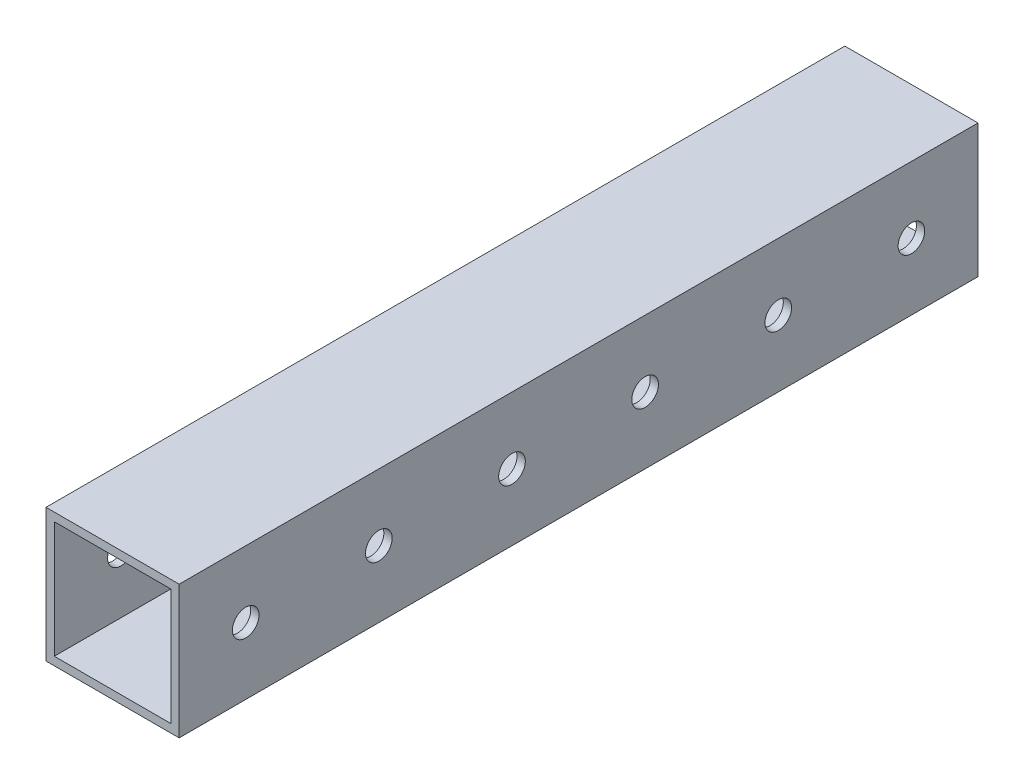
ISO-10303-21;
HEADER;
FILE_DESCRIPTION(('STEP AP214'),'2;1');
FILE_NAME('part.step','',(''),(''),'','','');
FILE_SCHEMA(('AUTOMOTIVE_DESIGN { 1 0 10303 214 1 1 1 1 }'));
ENDSEC;
DATA;
#1=APPLICATION_CONTEXT('core data for automotive mechanical design processes');
#2=APPLICATION_PROTOCOL_DEFINITION('international standard','automotive_design',2000,#1);
#3=PRODUCT_CONTEXT('',#1,'mechanical');
#4=PRODUCT('Part','Part','',(#3));
#5=PRODUCT_RELATED_PRODUCT_CATEGORY('part','',(#4));
#6=PRODUCT_DEFINITION_FORMATION('','',#4);
#7=PRODUCT_DEFINITION_CONTEXT('part definition',#1,'design');
#8=PRODUCT_DEFINITION('design','',#6,#7);
#9=PRODUCT_DEFINITION_SHAPE('','',#8);
#10=(LENGTH_UNIT() NAMED_UNIT(*) SI_UNIT(.MILLI.,.METRE.));
#11=(NAMED_UNIT(*) PLANE_ANGLE_UNIT() SI_UNIT($,.RADIAN.));
#12=(NAMED_UNIT(*) SI_UNIT($,.STERADIAN.) SOLID_ANGLE_UNIT());
#13=UNCERTAINTY_MEASURE_WITH_UNIT(LENGTH_MEASURE(1.E-05),#10,'distance_accuracy_value','');
#14=(GEOMETRIC_REPRESENTATION_CONTEXT(3) GLOBAL_UNCERTAINTY_ASSIGNED_CONTEXT((#13)) GLOBAL_UNIT_ASSIGNED_CONTEXT((#10,
#11,#12)) REPRESENTATION_CONTEXT('',''));
#15=CARTESIAN_POINT('',(0.,0.,0.));
#16=DIRECTION('',(0.,0.,1.));
#17=DIRECTION('',(1.,0.,0.));
#18=AXIS2_PLACEMENT_3D('',#15,#16,#17);
#19=CARTESIAN_POINT('',(0.,0.,152.4));
#20=DIRECTION('',(0.,0.,-1.));
#21=DIRECTION('',(-1.,0.,0.));
#22=AXIS2_PLACEMENT_3D('',#19,#20,#21);
#23=PLANE('',#22);
#24=DIRECTION('',(0.,-1.,0.));
#25=VECTOR('',#24,1.);
#26=CARTESIAN_POINT('',(0.,0.,152.4));
#27=LINE('',#26,#25);
#28=CARTESIAN_POINT('',(0.,25.4,152.4));
#29=VERTEX_POINT('',#28);
#30=CARTESIAN_POINT('',(0.,0.,152.4));
#31=VERTEX_POINT('',#30);
#32=EDGE_CURVE('E157',#29,#31,#27,.T.);
#33=ORIENTED_EDGE('',*,*,#32,.T.);
#34=DIRECTION('',(1.,0.,0.));
#35=VECTOR('',#34,1.);
#36=CARTESIAN_POINT('',(0.,0.,152.4));
#37=LINE('',#36,#35);
#38=CARTESIAN_POINT('',(25.4,0.,152.4));
#39=VERTEX_POINT('',#38);
#40=EDGE_CURVE('E161',#31,#39,#37,.T.);
#41=ORIENTED_EDGE('',*,*,#40,.T.);
#42=DIRECTION('',(0.,1.,0.));
#43=VECTOR('',#42,1.);
#44=CARTESIAN_POINT('',(25.4,0.,152.4));
#45=LINE('',#44,#43);
#46=CARTESIAN_POINT('',(25.4,25.4,152.4));
#47=VERTEX_POINT('',#46);
#48=EDGE_CURVE('E165',#39,#47,#45,.T.);
#49=ORIENTED_EDGE('',*,*,#48,.T.);
#50=DIRECTION('',(-1.,0.,0.));
#51=VECTOR('',#50,1.);
#52=CARTESIAN_POINT('',(0.,25.4,152.4));
#53=LINE('',#52,#51);
#54=EDGE_CURVE('E168',#47,#29,#53,.T.);
#55=ORIENTED_EDGE('',*,*,#54,.T.);
#56=EDGE_LOOP('',(#33,#41,#49,#55));
#57=FACE_BOUND('',#56,.T.);
#58=DIRECTION('',(0.,-1.,0.));
#59=VECTOR('',#58,1.);
#60=CARTESIAN_POINT('',(1.5875,1.5875,152.4));
#61=LINE('',#60,#59);
#62=CARTESIAN_POINT('',(1.5875,23.8125,152.4));
#63=VERTEX_POINT('',#62);
#64=CARTESIAN_POINT('',(1.5875,1.5875,152.4));
#65=VERTEX_POINT('',#64);
#66=EDGE_CURVE('E107',#63,#65,#61,.T.);
#67=ORIENTED_EDGE('',*,*,#66,.F.);
#68=DIRECTION('',(-1.,0.,0.));
#69=VECTOR('',#68,1.);
#70=CARTESIAN_POINT('',(1.5875,23.8125,152.4));
#71=LINE('',#70,#69);
#72=CARTESIAN_POINT('',(23.8125,23.8125,152.4));
#73=VERTEX_POINT('',#72);
#74=EDGE_CURVE('E133',#73,#63,#71,.T.);
#75=ORIENTED_EDGE('',*,*,#74,.F.);
#76=DIRECTION('',(0.,1.,0.));
#77=VECTOR('',#76,1.);
#78=CARTESIAN_POINT('',(23.8125,1.5875,152.4));
#79=LINE('',#78,#77);
#80=CARTESIAN_POINT('',(23.8125,1.5875,152.4));
#81=VERTEX_POINT('',#80);
#82=EDGE_CURVE('E129',#81,#73,#79,.T.);
#83=ORIENTED_EDGE('',*,*,#82,.F.);
#84=DIRECTION('',(1.,0.,0.));
#85=VECTOR('',#84,1.);
#86=CARTESIAN_POINT('',(1.5875,1.5875,152.4));
#87=LINE('',#86,#85);
#88=EDGE_CURVE('E116',#65,#81,#87,.T.);
#89=ORIENTED_EDGE('',*,*,#88,.F.);
#90=EDGE_LOOP('',(#67,#75,#83,#89));
#91=FACE_BOUND('',#90,.T.);
#92=ADVANCED_FACE('F39',(#57,#91),#23,.F.);
#93=CARTESIAN_POINT('',(0.,0.,0.));
#94=DIRECTION('',(0.,0.,-1.));
#95=DIRECTION('',(-1.,0.,0.));
#96=AXIS2_PLACEMENT_3D('',#93,#94,#95);
#97=PLANE('',#96);
#98=DIRECTION('',(0.,-1.,0.));
#99=VECTOR('',#98,1.);
#100=CARTESIAN_POINT('',(0.,0.,0.));
#101=LINE('',#100,#99);
#102=CARTESIAN_POINT('',(0.,25.4,0.));
#103=VERTEX_POINT('',#102);
#104=CARTESIAN_POINT('',(0.,0.,0.));
#105=VERTEX_POINT('',#104);
#106=EDGE_CURVE('E125',#103,#105,#101,.T.);
#107=ORIENTED_EDGE('',*,*,#106,.F.);
#108=DIRECTION('',(-1.,0.,0.));
#109=VECTOR('',#108,1.);
#110=CARTESIAN_POINT('',(0.,25.4,0.));
#111=LINE('',#110,#109);
#112=CARTESIAN_POINT('',(25.4,25.4,0.));
#113=VERTEX_POINT('',#112);
#114=EDGE_CURVE('E162',#113,#103,#111,.T.);
#115=ORIENTED_EDGE('',*,*,#114,.F.);
#116=DIRECTION('',(0.,1.,0.));
#117=VECTOR('',#116,1.);
#118=CARTESIAN_POINT('',(25.4,0.,0.));
#119=LINE('',#118,#117);
#120=CARTESIAN_POINT('',(25.4,0.,0.));
#121=VERTEX_POINT('',#120);
#122=EDGE_CURVE('E178',#121,#113,#119,.T.);
#123=ORIENTED_EDGE('',*,*,#122,.F.);
#124=DIRECTION('',(1.,0.,0.));
#125=VECTOR('',#124,1.);
#126=CARTESIAN_POINT('',(0.,0.,0.));
#127=LINE('',#126,#125);
#128=EDGE_CURVE('E175',#105,#121,#127,.T.);
#129=ORIENTED_EDGE('',*,*,#128,.F.);
#130=EDGE_LOOP('',(#107,#115,#123,#129));
#131=FACE_BOUND('',#130,.T.);
#132=DIRECTION('',(-1.,0.,0.));
#133=VECTOR('',#132,1.);
#134=CARTESIAN_POINT('',(1.5875,23.8125,0.));
#135=LINE('',#134,#133);
#136=CARTESIAN_POINT('',(23.8125,23.8125,0.));
#137=VERTEX_POINT('',#136);
#138=CARTESIAN_POINT('',(1.5875,23.8125,0.));
#139=VERTEX_POINT('',#138);
#140=EDGE_CURVE('E117',#137,#139,#135,.T.);
#141=ORIENTED_EDGE('',*,*,#140,.T.);
#142=DIRECTION('',(0.,-1.,0.));
#143=VECTOR('',#142,1.);
#144=CARTESIAN_POINT('',(1.5875,1.5875,0.));
#145=LINE('',#144,#143);
#146=CARTESIAN_POINT('',(1.5875,1.5875,0.));
#147=VERTEX_POINT('',#146);
#148=EDGE_CURVE('E65',#139,#147,#145,.T.);
#149=ORIENTED_EDGE('',*,*,#148,.T.);
#150=DIRECTION('',(1.,0.,0.));
#151=VECTOR('',#150,1.);
#152=CARTESIAN_POINT('',(1.5875,1.5875,0.));
#153=LINE('',#152,#151);
#154=CARTESIAN_POINT('',(23.8125,1.5875,0.));
#155=VERTEX_POINT('',#154);
#156=EDGE_CURVE('E123',#147,#155,#153,.T.);
#157=ORIENTED_EDGE('',*,*,#156,.T.);
#158=DIRECTION('',(0.,1.,0.));
#159=VECTOR('',#158,1.);
#160=CARTESIAN_POINT('',(23.8125,1.5875,0.));
#161=LINE('',#160,#159);
#162=EDGE_CURVE('E144',#155,#137,#161,.T.);
#163=ORIENTED_EDGE('',*,*,#162,.T.);
#164=EDGE_LOOP('',(#141,#149,#157,#163));
#165=FACE_BOUND('',#164,.T.);
#166=ADVANCED_FACE('F256',(#131,#165),#97,.T.);
#167=CARTESIAN_POINT('',(0.,0.,152.4));
#168=DIRECTION('',(1.,0.,0.));
#169=DIRECTION('',(0.,0.,-1.));
#170=AXIS2_PLACEMENT_3D('',#167,#168,#169);
#171=PLANE('',#170);
#172=CARTESIAN_POINT('',(0.,12.7,139.7));
#173=DIRECTION('',(1.,0.,0.));
#174=DIRECTION('',(0.,0.,-1.));
#175=AXIS2_PLACEMENT_3D('',#172,#173,#174);
#176=CIRCLE('',#175,2.53999999999998);
#177=CARTESIAN_POINT('',(0.,12.7,137.16));
#178=VERTEX_POINT('',#177);
#179=EDGE_CURVE('E198',#178,#178,#176,.T.);
#180=ORIENTED_EDGE('',*,*,#179,.T.);
#181=EDGE_LOOP('',(#180));
#182=FACE_BOUND('',#181,.T.);
#183=CARTESIAN_POINT('',(0.,12.7,114.3));
#184=DIRECTION('',(1.,0.,0.));
#185=DIRECTION('',(0.,0.,-1.));
#186=AXIS2_PLACEMENT_3D('',#183,#184,#185);
#187=CIRCLE('',#186,2.53999999999998);
#188=CARTESIAN_POINT('',(0.,12.7,111.76));
#189=VERTEX_POINT('',#188);
#190=EDGE_CURVE('E312',#189,#189,#187,.T.);
#191=ORIENTED_EDGE('',*,*,#190,.T.);
#192=EDGE_LOOP('',(#191));
#193=FACE_BOUND('',#192,.T.);
#194=CARTESIAN_POINT('',(0.,12.7,88.9));
#195=DIRECTION('',(1.,0.,0.));
#196=DIRECTION('',(0.,0.,-1.));
#197=AXIS2_PLACEMENT_3D('',#194,#195,#196);
#198=CIRCLE('',#197,2.53999999999998);
#199=CARTESIAN_POINT('',(0.,12.7,86.36));
#200=VERTEX_POINT('',#199);
#201=EDGE_CURVE('E316',#200,#200,#198,.T.);
#202=ORIENTED_EDGE('',*,*,#201,.T.);
#203=EDGE_LOOP('',(#202));
#204=FACE_BOUND('',#203,.T.);
#205=CARTESIAN_POINT('',(0.,12.7,63.5));
#206=DIRECTION('',(1.,0.,0.));
#207=DIRECTION('',(0.,0.,1.));
#208=AXIS2_PLACEMENT_3D('',#205,#206,#207);
#209=CIRCLE('',#208,2.53999999999998);
#210=CARTESIAN_POINT('',(0.,12.7,66.04));
#211=VERTEX_POINT('',#210);
#212=EDGE_CURVE('E320',#211,#211,#209,.T.);
#213=ORIENTED_EDGE('',*,*,#212,.T.);
#214=EDGE_LOOP('',(#213));
#215=FACE_BOUND('',#214,.T.);
#216=CARTESIAN_POINT('',(0.,12.7,38.1));
#217=DIRECTION('',(1.,0.,0.));
#218=DIRECTION('',(0.,0.,1.));
#219=AXIS2_PLACEMENT_3D('',#216,#217,#218);
#220=CIRCLE('',#219,2.53999999999998);
#221=CARTESIAN_POINT('',(0.,12.7,40.64));
#222=VERTEX_POINT('',#221);
#223=EDGE_CURVE('E324',#222,#222,#220,.T.);
#224=ORIENTED_EDGE('',*,*,#223,.T.);
#225=EDGE_LOOP('',(#224));
#226=FACE_BOUND('',#225,.T.);
#227=CARTESIAN_POINT('',(0.,12.7,12.7));
#228=DIRECTION('',(1.,0.,0.));
#229=DIRECTION('',(0.,0.,1.));
#230=AXIS2_PLACEMENT_3D('',#227,#228,#229);
#231=CIRCLE('',#230,2.53999999999998);
#232=CARTESIAN_POINT('',(0.,12.7,15.24));
#233=VERTEX_POINT('',#232);
#234=EDGE_CURVE('E327',#233,#233,#231,.T.);
#235=ORIENTED_EDGE('',*,*,#234,.T.);
#236=EDGE_LOOP('',(#235));
#237=FACE_BOUND('',#236,.T.);
#238=ORIENTED_EDGE('',*,*,#106,.T.);
#239=DIRECTION('',(0.,0.,-1.));
#240=VECTOR('',#239,1.);
#241=CARTESIAN_POINT('',(0.,0.,152.4));
#242=LINE('',#241,#240);
#243=EDGE_CURVE('E11',#31,#105,#242,.T.);
#244=ORIENTED_EDGE('',*,*,#243,.F.);
#245=ORIENTED_EDGE('',*,*,#32,.F.);
#246=DIRECTION('',(0.,0.,-1.));
#247=VECTOR('',#246,1.);
#248=CARTESIAN_POINT('',(0.,25.4,152.4));
#249=LINE('',#248,#247);
#250=EDGE_CURVE('E171',#29,#103,#249,.T.);
#251=ORIENTED_EDGE('',*,*,#250,.T.);
#252=EDGE_LOOP('',(#238,#244,#245,#251));
#253=FACE_BOUND('',#252,.T.);
#254=ADVANCED_FACE('F41',(#182,#193,#204,#215,#226,#237,#253),#171,.F.);
#255=CARTESIAN_POINT('',(0.,0.,152.4));
#256=DIRECTION('',(0.,1.,0.));
#257=DIRECTION('',(0.,0.,1.));
#258=AXIS2_PLACEMENT_3D('',#255,#256,#257);
#259=PLANE('',#258);
#260=ORIENTED_EDGE('',*,*,#128,.T.);
#261=DIRECTION('',(0.,0.,-1.));
#262=VECTOR('',#261,1.);
#263=CARTESIAN_POINT('',(25.4,0.,152.4));
#264=LINE('',#263,#262);
#265=EDGE_CURVE('E49',#39,#121,#264,.T.);
#266=ORIENTED_EDGE('',*,*,#265,.F.);
#267=ORIENTED_EDGE('',*,*,#40,.F.);
#268=ORIENTED_EDGE('',*,*,#243,.T.);
#269=EDGE_LOOP('',(#260,#266,#267,#268));
#270=FACE_BOUND('',#269,.T.);
#271=ADVANCED_FACE('F284',(#270),#259,.F.);
#272=CARTESIAN_POINT('',(25.4,0.,152.4));
#273=DIRECTION('',(-1.,0.,0.));
#274=DIRECTION('',(0.,0.,1.));
#275=AXIS2_PLACEMENT_3D('',#272,#273,#274);
#276=PLANE('',#275);
#277=CARTESIAN_POINT('',(25.4,12.7,139.7));
#278=DIRECTION('',(1.,0.,0.));
#279=DIRECTION('',(0.,0.,-1.));
#280=AXIS2_PLACEMENT_3D('',#277,#278,#279);
#281=CIRCLE('',#280,2.53999999999998);
#282=CARTESIAN_POINT('',(25.4,12.7,137.16));
#283=VERTEX_POINT('',#282);
#284=EDGE_CURVE('E391',#283,#283,#281,.T.);
#285=ORIENTED_EDGE('',*,*,#284,.F.);
#286=EDGE_LOOP('',(#285));
#287=FACE_BOUND('',#286,.T.);
#288=CARTESIAN_POINT('',(25.4,12.7,114.3));
#289=DIRECTION('',(1.,0.,0.));
#290=DIRECTION('',(0.,0.,-1.));
#291=AXIS2_PLACEMENT_3D('',#288,#289,#290);
#292=CIRCLE('',#291,2.53999999999998);
#293=CARTESIAN_POINT('',(25.4,12.7,111.76));
#294=VERTEX_POINT('',#293);
#295=EDGE_CURVE('E392',#294,#294,#292,.T.);
#296=ORIENTED_EDGE('',*,*,#295,.F.);
#297=EDGE_LOOP('',(#296));
#298=FACE_BOUND('',#297,.T.);
#299=CARTESIAN_POINT('',(25.4,12.7,88.9));
#300=DIRECTION('',(1.,0.,0.));
#301=DIRECTION('',(0.,0.,-1.));
#302=AXIS2_PLACEMENT_3D('',#299,#300,#301);
#303=CIRCLE('',#302,2.53999999999998);
#304=CARTESIAN_POINT('',(25.4,12.7,86.36));
#305=VERTEX_POINT('',#304);
#306=EDGE_CURVE('E404',#305,#305,#303,.T.);
#307=ORIENTED_EDGE('',*,*,#306,.F.);
#308=EDGE_LOOP('',(#307));
#309=FACE_BOUND('',#308,.T.);
#310=CARTESIAN_POINT('',(25.4,12.7,63.5));
#311=DIRECTION('',(1.,0.,0.));
#312=DIRECTION('',(0.,0.,1.));
#313=AXIS2_PLACEMENT_3D('',#310,#311,#312);
#314=CIRCLE('',#313,2.53999999999998);
#315=CARTESIAN_POINT('',(25.4,12.7,66.04));
#316=VERTEX_POINT('',#315);
#317=EDGE_CURVE('E410',#316,#316,#314,.T.);
#318=ORIENTED_EDGE('',*,*,#317,.F.);
#319=EDGE_LOOP('',(#318));
#320=FACE_BOUND('',#319,.T.);
#321=CARTESIAN_POINT('',(25.4,12.7,38.1));
#322=DIRECTION('',(1.,0.,0.));
#323=DIRECTION('',(0.,0.,1.));
#324=AXIS2_PLACEMENT_3D('',#321,#322,#323);
#325=CIRCLE('',#324,2.53999999999998);
#326=CARTESIAN_POINT('',(25.4,12.7,40.64));
#327=VERTEX_POINT('',#326);
#328=EDGE_CURVE('E330',#327,#327,#325,.T.);
#329=ORIENTED_EDGE('',*,*,#328,.F.);
#330=EDGE_LOOP('',(#329));
#331=FACE_BOUND('',#330,.T.);
#332=CARTESIAN_POINT('',(25.4,12.7,12.7));
#333=DIRECTION('',(1.,0.,0.));
#334=DIRECTION('',(0.,0.,1.));
#335=AXIS2_PLACEMENT_3D('',#332,#333,#334);
#336=CIRCLE('',#335,2.53999999999998);
#337=CARTESIAN_POINT('',(25.4,12.7,15.24));
#338=VERTEX_POINT('',#337);
#339=EDGE_CURVE('E331',#338,#338,#336,.T.);
#340=ORIENTED_EDGE('',*,*,#339,.F.);
#341=EDGE_LOOP('',(#340));
#342=FACE_BOUND('',#341,.T.);
#343=ORIENTED_EDGE('',*,*,#122,.T.);
#344=DIRECTION('',(0.,0.,-1.));
#345=VECTOR('',#344,1.);
#346=CARTESIAN_POINT('',(25.4,25.4,152.4));
#347=LINE('',#346,#345);
#348=EDGE_CURVE('E186',#47,#113,#347,.T.);
#349=ORIENTED_EDGE('',*,*,#348,.F.);
#350=ORIENTED_EDGE('',*,*,#48,.F.);
#351=ORIENTED_EDGE('',*,*,#265,.T.);
#352=EDGE_LOOP('',(#343,#349,#350,#351));
#353=FACE_BOUND('',#352,.T.);
#354=ADVANCED_FACE('F281',(#287,#298,#309,#320,#331,#342,#353),#276,.F.);
#355=CARTESIAN_POINT('',(0.,25.4,152.4));
#356=DIRECTION('',(0.,-1.,0.));
#357=DIRECTION('',(0.,0.,-1.));
#358=AXIS2_PLACEMENT_3D('',#355,#356,#357);
#359=PLANE('',#358);
#360=ORIENTED_EDGE('',*,*,#114,.T.);
#361=ORIENTED_EDGE('',*,*,#250,.F.);
#362=ORIENTED_EDGE('',*,*,#54,.F.);
#363=ORIENTED_EDGE('',*,*,#348,.T.);
#364=EDGE_LOOP('',(#360,#361,#362,#363));
#365=FACE_BOUND('',#364,.T.);
#366=ADVANCED_FACE('F278',(#365),#359,.F.);
#367=CARTESIAN_POINT('',(1.5875,1.5875,152.4));
#368=DIRECTION('',(1.,0.,0.));
#369=DIRECTION('',(0.,0.,-1.));
#370=AXIS2_PLACEMENT_3D('',#367,#368,#369);
#371=PLANE('',#370);
#372=CARTESIAN_POINT('',(1.5875,12.7,139.7));
#373=DIRECTION('',(1.,0.,0.));
#374=DIRECTION('',(0.,0.,-1.));
#375=AXIS2_PLACEMENT_3D('',#372,#373,#374);
#376=CIRCLE('',#375,2.53999999999998);
#377=CARTESIAN_POINT('',(1.5875,12.7,137.16));
#378=VERTEX_POINT('',#377);
#379=EDGE_CURVE('E141',#378,#378,#376,.T.);
#380=ORIENTED_EDGE('',*,*,#379,.F.);
#381=EDGE_LOOP('',(#380));
#382=FACE_BOUND('',#381,.T.);
#383=CARTESIAN_POINT('',(1.5875,12.7,114.3));
#384=DIRECTION('',(1.,0.,0.));
#385=DIRECTION('',(0.,0.,-1.));
#386=AXIS2_PLACEMENT_3D('',#383,#384,#385);
#387=CIRCLE('',#386,2.53999999999998);
#388=CARTESIAN_POINT('',(1.5875,12.7,111.76));
#389=VERTEX_POINT('',#388);
#390=EDGE_CURVE('E216',#389,#389,#387,.T.);
#391=ORIENTED_EDGE('',*,*,#390,.F.);
#392=EDGE_LOOP('',(#391));
#393=FACE_BOUND('',#392,.T.);
#394=CARTESIAN_POINT('',(1.5875,12.7,88.9));
#395=DIRECTION('',(1.,0.,0.));
#396=DIRECTION('',(0.,0.,-1.));
#397=AXIS2_PLACEMENT_3D('',#394,#395,#396);
#398=CIRCLE('',#397,2.53999999999998);
#399=CARTESIAN_POINT('',(1.5875,12.7,86.36));
#400=VERTEX_POINT('',#399);
#401=EDGE_CURVE('E212',#400,#400,#398,.T.);
#402=ORIENTED_EDGE('',*,*,#401,.F.);
#403=EDGE_LOOP('',(#402));
#404=FACE_BOUND('',#403,.T.);
#405=CARTESIAN_POINT('',(1.5875,12.7,63.5));
#406=DIRECTION('',(1.,0.,0.));
#407=DIRECTION('',(0.,0.,-1.));
#408=AXIS2_PLACEMENT_3D('',#405,#406,#407);
#409=CIRCLE('',#408,2.53999999999998);
#410=CARTESIAN_POINT('',(1.5875,12.7,60.96));
#411=VERTEX_POINT('',#410);
#412=EDGE_CURVE('E208',#411,#411,#409,.T.);
#413=ORIENTED_EDGE('',*,*,#412,.F.);
#414=EDGE_LOOP('',(#413));
#415=FACE_BOUND('',#414,.T.);
#416=CARTESIAN_POINT('',(1.5875,12.7,38.1));
#417=DIRECTION('',(1.,0.,0.));
#418=DIRECTION('',(0.,0.,-1.));
#419=AXIS2_PLACEMENT_3D('',#416,#417,#418);
#420=CIRCLE('',#419,2.53999999999998);
#421=CARTESIAN_POINT('',(1.5875,12.7,35.56));
#422=VERTEX_POINT('',#421);
#423=EDGE_CURVE('E203',#422,#422,#420,.T.);
#424=ORIENTED_EDGE('',*,*,#423,.F.);
#425=EDGE_LOOP('',(#424));
#426=FACE_BOUND('',#425,.T.);
#427=CARTESIAN_POINT('',(1.5875,12.7,12.7));
#428=DIRECTION('',(1.,0.,0.));
#429=DIRECTION('',(0.,0.,-1.));
#430=AXIS2_PLACEMENT_3D('',#427,#428,#429);
#431=CIRCLE('',#430,2.53999999999998);
#432=CARTESIAN_POINT('',(1.5875,12.7,10.16));
#433=VERTEX_POINT('',#432);
#434=EDGE_CURVE('E197',#433,#433,#431,.T.);
#435=ORIENTED_EDGE('',*,*,#434,.F.);
#436=EDGE_LOOP('',(#435));
#437=FACE_BOUND('',#436,.T.);
#438=ORIENTED_EDGE('',*,*,#148,.F.);
#439=DIRECTION('',(0.,0.,-1.));
#440=VECTOR('',#439,1.);
#441=CARTESIAN_POINT('',(1.5875,23.8125,152.4));
#442=LINE('',#441,#440);
#443=EDGE_CURVE('E111',#63,#139,#442,.T.);
#444=ORIENTED_EDGE('',*,*,#443,.F.);
#445=ORIENTED_EDGE('',*,*,#66,.T.);
#446=DIRECTION('',(0.,0.,-1.));
#447=VECTOR('',#446,1.);
#448=CARTESIAN_POINT('',(1.5875,1.5875,152.4));
#449=LINE('',#448,#447);
#450=EDGE_CURVE('E110',#65,#147,#449,.T.);
#451=ORIENTED_EDGE('',*,*,#450,.T.);
#452=EDGE_LOOP('',(#438,#444,#445,#451));
#453=FACE_BOUND('',#452,.T.);
#454=ADVANCED_FACE('F109',(#382,#393,#404,#415,#426,#437,#453),#371,.T.);
#455=CARTESIAN_POINT('',(1.5875,1.5875,152.4));
#456=DIRECTION('',(0.,1.,0.));
#457=DIRECTION('',(0.,0.,1.));
#458=AXIS2_PLACEMENT_3D('',#455,#456,#457);
#459=PLANE('',#458);
#460=ORIENTED_EDGE('',*,*,#156,.F.);
#461=ORIENTED_EDGE('',*,*,#450,.F.);
#462=ORIENTED_EDGE('',*,*,#88,.T.);
#463=DIRECTION('',(0.,0.,-1.));
#464=VECTOR('',#463,1.);
#465=CARTESIAN_POINT('',(23.8125,1.5875,152.4));
#466=LINE('',#465,#464);
#467=EDGE_CURVE('E126',#81,#155,#466,.T.);
#468=ORIENTED_EDGE('',*,*,#467,.T.);
#469=EDGE_LOOP('',(#460,#461,#462,#468));
#470=FACE_BOUND('',#469,.T.);
#471=ADVANCED_FACE('F120',(#470),#459,.T.);
#472=CARTESIAN_POINT('',(23.8125,1.5875,152.4));
#473=DIRECTION('',(-1.,0.,0.));
#474=DIRECTION('',(0.,0.,1.));
#475=AXIS2_PLACEMENT_3D('',#472,#473,#474);
#476=PLANE('',#475);
#477=CARTESIAN_POINT('',(23.8125,12.7,139.7));
#478=DIRECTION('',(-1.,0.,0.));
#479=DIRECTION('',(0.,0.,1.));
#480=AXIS2_PLACEMENT_3D('',#477,#478,#479);
#481=CIRCLE('',#480,2.53999999999998);
#482=CARTESIAN_POINT('',(23.8125,12.7,142.24));
#483=VERTEX_POINT('',#482);
#484=EDGE_CURVE('E43',#483,#483,#481,.T.);
#485=ORIENTED_EDGE('',*,*,#484,.F.);
#486=EDGE_LOOP('',(#485));
#487=FACE_BOUND('',#486,.T.);
#488=CARTESIAN_POINT('',(23.8125,12.7,114.3));
#489=DIRECTION('',(-1.,0.,0.));
#490=DIRECTION('',(0.,0.,1.));
#491=AXIS2_PLACEMENT_3D('',#488,#489,#490);
#492=CIRCLE('',#491,2.53999999999998);
#493=CARTESIAN_POINT('',(23.8125,12.7,116.84));
#494=VERTEX_POINT('',#493);
#495=EDGE_CURVE('E213',#494,#494,#492,.T.);
#496=ORIENTED_EDGE('',*,*,#495,.F.);
#497=EDGE_LOOP('',(#496));
#498=FACE_BOUND('',#497,.T.);
#499=CARTESIAN_POINT('',(23.8125,12.7,88.9));
#500=DIRECTION('',(-1.,0.,0.));
#501=DIRECTION('',(0.,0.,1.));
#502=AXIS2_PLACEMENT_3D('',#499,#500,#501);
#503=CIRCLE('',#502,2.53999999999998);
#504=CARTESIAN_POINT('',(23.8125,12.7,91.44));
#505=VERTEX_POINT('',#504);
#506=EDGE_CURVE('E209',#505,#505,#503,.T.);
#507=ORIENTED_EDGE('',*,*,#506,.F.);
#508=EDGE_LOOP('',(#507));
#509=FACE_BOUND('',#508,.T.);
#510=CARTESIAN_POINT('',(23.8125,12.7,63.5));
#511=DIRECTION('',(-1.,0.,0.));
#512=DIRECTION('',(0.,0.,1.));
#513=AXIS2_PLACEMENT_3D('',#510,#511,#512);
#514=CIRCLE('',#513,2.53999999999998);
#515=CARTESIAN_POINT('',(23.8125,12.7,66.04));
#516=VERTEX_POINT('',#515);
#517=EDGE_CURVE('E204',#516,#516,#514,.T.);
#518=ORIENTED_EDGE('',*,*,#517,.F.);
#519=EDGE_LOOP('',(#518));
#520=FACE_BOUND('',#519,.T.);
#521=CARTESIAN_POINT('',(23.8125,12.7,38.1));
#522=DIRECTION('',(-1.,0.,0.));
#523=DIRECTION('',(0.,0.,1.));
#524=AXIS2_PLACEMENT_3D('',#521,#522,#523);
#525=CIRCLE('',#524,2.53999999999998);
#526=CARTESIAN_POINT('',(23.8125,12.7,40.64));
#527=VERTEX_POINT('',#526);
#528=EDGE_CURVE('E199',#527,#527,#525,.T.);
#529=ORIENTED_EDGE('',*,*,#528,.F.);
#530=EDGE_LOOP('',(#529));
#531=FACE_BOUND('',#530,.T.);
#532=CARTESIAN_POINT('',(23.8125,12.7,12.7));
#533=DIRECTION('',(-1.,0.,0.));
#534=DIRECTION('',(0.,0.,1.));
#535=AXIS2_PLACEMENT_3D('',#532,#533,#534);
#536=CIRCLE('',#535,2.53999999999998);
#537=CARTESIAN_POINT('',(23.8125,12.7,15.24));
#538=VERTEX_POINT('',#537);
#539=EDGE_CURVE('E193',#538,#538,#536,.T.);
#540=ORIENTED_EDGE('',*,*,#539,.F.);
#541=EDGE_LOOP('',(#540));
#542=FACE_BOUND('',#541,.T.);
#543=ORIENTED_EDGE('',*,*,#162,.F.);
#544=ORIENTED_EDGE('',*,*,#467,.F.);
#545=ORIENTED_EDGE('',*,*,#82,.T.);
#546=DIRECTION('',(0.,0.,-1.));
#547=VECTOR('',#546,1.);
#548=CARTESIAN_POINT('',(23.8125,23.8125,152.4));
#549=LINE('',#548,#547);
#550=EDGE_CURVE('E57',#73,#137,#549,.T.);
#551=ORIENTED_EDGE('',*,*,#550,.T.);
#552=EDGE_LOOP('',(#543,#544,#545,#551));
#553=FACE_BOUND('',#552,.T.);
#554=ADVANCED_FACE('F240',(#487,#498,#509,#520,#531,#542,#553),#476,.T.);
#555=CARTESIAN_POINT('',(1.5875,23.8125,152.4));
#556=DIRECTION('',(0.,-1.,0.));
#557=DIRECTION('',(0.,0.,-1.));
#558=AXIS2_PLACEMENT_3D('',#555,#556,#557);
#559=PLANE('',#558);
#560=ORIENTED_EDGE('',*,*,#140,.F.);
#561=ORIENTED_EDGE('',*,*,#550,.F.);
#562=ORIENTED_EDGE('',*,*,#74,.T.);
#563=ORIENTED_EDGE('',*,*,#443,.T.);
#564=EDGE_LOOP('',(#560,#561,#562,#563));
#565=FACE_BOUND('',#564,.T.);
#566=ADVANCED_FACE('F243',(#565),#559,.T.);
#567=CARTESIAN_POINT('',(0.,12.7,12.7));
#568=DIRECTION('',(1.,0.,0.));
#569=DIRECTION('',(0.,0.,-1.));
#570=AXIS2_PLACEMENT_3D('',#567,#568,#569);
#571=CYLINDRICAL_SURFACE('',#570,2.53999999999998);
#572=ORIENTED_EDGE('',*,*,#539,.T.);
#573=EDGE_LOOP('',(#572));
#574=FACE_BOUND('',#573,.T.);
#575=ORIENTED_EDGE('',*,*,#339,.T.);
#576=EDGE_LOOP('',(#575));
#577=FACE_BOUND('',#576,.T.);
#578=ADVANCED_FACE('F258',(#574,#577),#571,.F.);
#579=CARTESIAN_POINT('',(0.,12.7,38.1));
#580=DIRECTION('',(1.,0.,0.));
#581=DIRECTION('',(0.,0.,-1.));
#582=AXIS2_PLACEMENT_3D('',#579,#580,#581);
#583=CYLINDRICAL_SURFACE('',#582,2.53999999999998);
#584=ORIENTED_EDGE('',*,*,#528,.T.);
#585=EDGE_LOOP('',(#584));
#586=FACE_BOUND('',#585,.T.);
#587=ORIENTED_EDGE('',*,*,#328,.T.);
#588=EDGE_LOOP('',(#587));
#589=FACE_BOUND('',#588,.T.);
#590=ADVANCED_FACE('F263',(#586,#589),#583,.F.);
#591=CARTESIAN_POINT('',(0.,12.7,63.5));
#592=DIRECTION('',(1.,0.,0.));
#593=DIRECTION('',(0.,0.,-1.));
#594=AXIS2_PLACEMENT_3D('',#591,#592,#593);
#595=CYLINDRICAL_SURFACE('',#594,2.53999999999998);
#596=ORIENTED_EDGE('',*,*,#517,.T.);
#597=EDGE_LOOP('',(#596));
#598=FACE_BOUND('',#597,.T.);
#599=ORIENTED_EDGE('',*,*,#317,.T.);
#600=EDGE_LOOP('',(#599));
#601=FACE_BOUND('',#600,.T.);
#602=ADVANCED_FACE('F367',(#598,#601),#595,.F.);
#603=CARTESIAN_POINT('',(0.,12.7,88.9));
#604=DIRECTION('',(1.,0.,0.));
#605=DIRECTION('',(0.,0.,-1.));
#606=AXIS2_PLACEMENT_3D('',#603,#604,#605);
#607=CYLINDRICAL_SURFACE('',#606,2.53999999999998);
#608=ORIENTED_EDGE('',*,*,#506,.T.);
#609=EDGE_LOOP('',(#608));
#610=FACE_BOUND('',#609,.T.);
#611=ORIENTED_EDGE('',*,*,#306,.T.);
#612=EDGE_LOOP('',(#611));
#613=FACE_BOUND('',#612,.T.);
#614=ADVANCED_FACE('F371',(#610,#613),#607,.F.);
#615=CARTESIAN_POINT('',(0.,12.7,114.3));
#616=DIRECTION('',(1.,0.,0.));
#617=DIRECTION('',(0.,0.,-1.));
#618=AXIS2_PLACEMENT_3D('',#615,#616,#617);
#619=CYLINDRICAL_SURFACE('',#618,2.53999999999998);
#620=ORIENTED_EDGE('',*,*,#495,.T.);
#621=EDGE_LOOP('',(#620));
#622=FACE_BOUND('',#621,.T.);
#623=ORIENTED_EDGE('',*,*,#295,.T.);
#624=EDGE_LOOP('',(#623));
#625=FACE_BOUND('',#624,.T.);
#626=ADVANCED_FACE('F362',(#622,#625),#619,.F.);
#627=CARTESIAN_POINT('',(0.,12.7,139.7));
#628=DIRECTION('',(1.,0.,0.));
#629=DIRECTION('',(0.,0.,-1.));
#630=AXIS2_PLACEMENT_3D('',#627,#628,#629);
#631=CYLINDRICAL_SURFACE('',#630,2.53999999999998);
#632=ORIENTED_EDGE('',*,*,#484,.T.);
#633=EDGE_LOOP('',(#632));
#634=FACE_BOUND('',#633,.T.);
#635=ORIENTED_EDGE('',*,*,#284,.T.);
#636=EDGE_LOOP('',(#635));
#637=FACE_BOUND('',#636,.T.);
#638=ADVANCED_FACE('F237',(#634,#637),#631,.F.);
#639=ORIENTED_EDGE('',*,*,#434,.T.);
#640=EDGE_LOOP('',(#639));
#641=FACE_BOUND('',#640,.T.);
#642=ORIENTED_EDGE('',*,*,#234,.F.);
#643=EDGE_LOOP('',(#642));
#644=FACE_BOUND('',#643,.T.);
#645=ADVANCED_FACE('F266',(#641,#644),#571,.F.);
#646=ORIENTED_EDGE('',*,*,#423,.T.);
#647=EDGE_LOOP('',(#646));
#648=FACE_BOUND('',#647,.T.);
#649=ORIENTED_EDGE('',*,*,#223,.F.);
#650=EDGE_LOOP('',(#649));
#651=FACE_BOUND('',#650,.T.);
#652=ADVANCED_FACE('F347',(#648,#651),#583,.F.);
#653=ORIENTED_EDGE('',*,*,#412,.T.);
#654=EDGE_LOOP('',(#653));
#655=FACE_BOUND('',#654,.T.);
#656=ORIENTED_EDGE('',*,*,#212,.F.);
#657=EDGE_LOOP('',(#656));
#658=FACE_BOUND('',#657,.T.);
#659=ADVANCED_FACE('F360',(#655,#658),#595,.F.);
#660=ORIENTED_EDGE('',*,*,#401,.T.);
#661=EDGE_LOOP('',(#660));
#662=FACE_BOUND('',#661,.T.);
#663=ORIENTED_EDGE('',*,*,#201,.F.);
#664=EDGE_LOOP('',(#663));
#665=FACE_BOUND('',#664,.T.);
#666=ADVANCED_FACE('F376',(#662,#665),#607,.F.);
#667=ORIENTED_EDGE('',*,*,#390,.T.);
#668=EDGE_LOOP('',(#667));
#669=FACE_BOUND('',#668,.T.);
#670=ORIENTED_EDGE('',*,*,#190,.F.);
#671=EDGE_LOOP('',(#670));
#672=FACE_BOUND('',#671,.T.);
#673=ADVANCED_FACE('F378',(#669,#672),#619,.F.);
#674=ORIENTED_EDGE('',*,*,#379,.T.);
#675=EDGE_LOOP('',(#674));
#676=FACE_BOUND('',#675,.T.);
#677=ORIENTED_EDGE('',*,*,#179,.F.);
#678=EDGE_LOOP('',(#677));
#679=FACE_BOUND('',#678,.T.);
#680=ADVANCED_FACE('F364',(#676,#679),#631,.F.);
#681=CLOSED_SHELL('',(#92,#166,#254,#271,#354,#366,#454,#471,#554,#566,#578,#590,#602,#614,#626,
#638,#645,#652,#659,#666,#673,#680));
#682=MANIFOLD_SOLID_BREP('B2',#681);
#683=ADVANCED_BREP_SHAPE_REPRESENTATION('',(#18,#682),#14);
#684=SHAPE_DEFINITION_REPRESENTATION(#9,#683);
ENDSEC;
END-ISO-10303-21;
